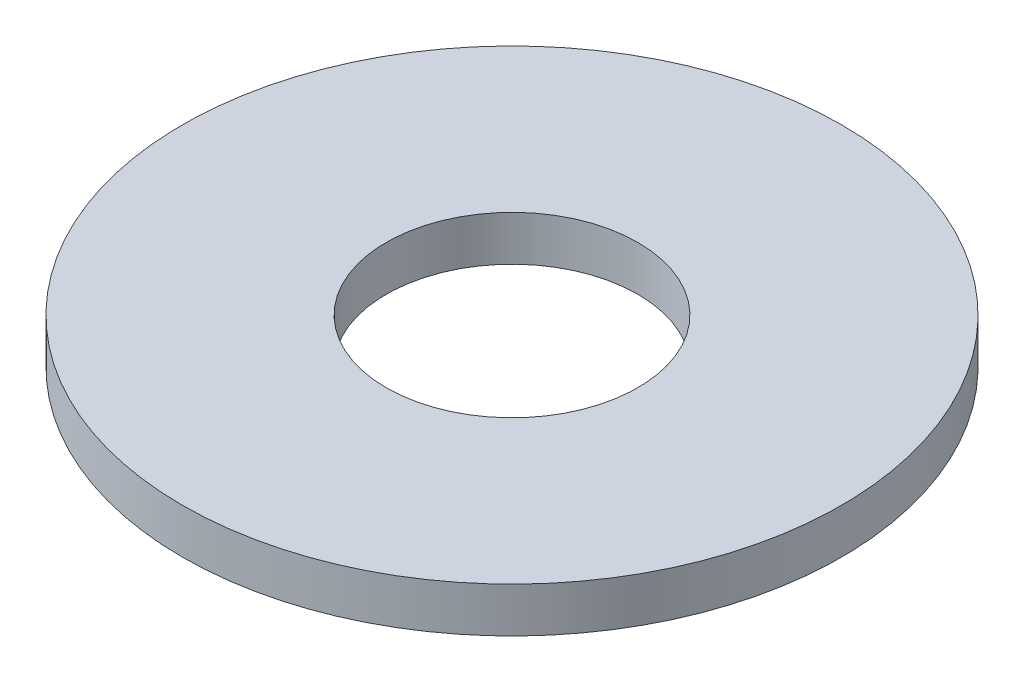
ISO-10303-21;
HEADER;
FILE_DESCRIPTION(('STEP AP214'),'2;1');
FILE_NAME('part.step','',(''),(''),'','','');
FILE_SCHEMA(('AUTOMOTIVE_DESIGN { 1 0 10303 214 1 1 1 1 }'));
ENDSEC;
DATA;
#1=APPLICATION_CONTEXT('core data for automotive mechanical design processes');
#2=APPLICATION_PROTOCOL_DEFINITION('international standard','automotive_design',2000,#1);
#3=PRODUCT_CONTEXT('',#1,'mechanical');
#4=PRODUCT('Part','Part','',(#3));
#5=PRODUCT_RELATED_PRODUCT_CATEGORY('part','',(#4));
#6=PRODUCT_DEFINITION_FORMATION('','',#4);
#7=PRODUCT_DEFINITION_CONTEXT('part definition',#1,'design');
#8=PRODUCT_DEFINITION('design','',#6,#7);
#9=PRODUCT_DEFINITION_SHAPE('','',#8);
#10=(LENGTH_UNIT() NAMED_UNIT(*) SI_UNIT(.MILLI.,.METRE.));
#11=(NAMED_UNIT(*) PLANE_ANGLE_UNIT() SI_UNIT($,.RADIAN.));
#12=(NAMED_UNIT(*) SI_UNIT($,.STERADIAN.) SOLID_ANGLE_UNIT());
#13=UNCERTAINTY_MEASURE_WITH_UNIT(LENGTH_MEASURE(1.E-05),#10,'distance_accuracy_value','');
#14=(GEOMETRIC_REPRESENTATION_CONTEXT(3) GLOBAL_UNCERTAINTY_ASSIGNED_CONTEXT((#13)) GLOBAL_UNIT_ASSIGNED_CONTEXT((#10,
#11,#12)) REPRESENTATION_CONTEXT('',''));
#15=CARTESIAN_POINT('',(0.,0.,0.));
#16=DIRECTION('',(0.,0.,1.));
#17=DIRECTION('',(1.,0.,0.));
#18=AXIS2_PLACEMENT_3D('',#15,#16,#17);
#19=CARTESIAN_POINT('',(0.,0.,0.));
#20=DIRECTION('',(0.,-1.,0.));
#21=DIRECTION('',(0.,0.,-1.));
#22=AXIS2_PLACEMENT_3D('',#19,#20,#21);
#23=CYLINDRICAL_SURFACE('',#22,11.);
#24=CARTESIAN_POINT('',(0.,1.5,0.));
#25=DIRECTION('',(0.,-1.,0.));
#26=DIRECTION('',(0.,0.,-1.));
#27=AXIS2_PLACEMENT_3D('',#24,#25,#26);
#28=CIRCLE('',#27,11.);
#29=CARTESIAN_POINT('',(0.,1.5,-11.));
#30=VERTEX_POINT('',#29);
#31=EDGE_CURVE('E46',#30,#30,#28,.T.);
#32=ORIENTED_EDGE('',*,*,#31,.T.);
#33=EDGE_LOOP('',(#32));
#34=FACE_BOUND('',#33,.T.);
#35=CARTESIAN_POINT('',(0.,0.,0.));
#36=DIRECTION('',(0.,-1.,0.));
#37=DIRECTION('',(0.,0.,-1.));
#38=AXIS2_PLACEMENT_3D('',#35,#36,#37);
#39=CIRCLE('',#38,11.);
#40=CARTESIAN_POINT('',(0.,0.,-11.));
#41=VERTEX_POINT('',#40);
#42=EDGE_CURVE('E10',#41,#41,#39,.T.);
#43=ORIENTED_EDGE('',*,*,#42,.F.);
#44=EDGE_LOOP('',(#43));
#45=FACE_BOUND('',#44,.T.);
#46=ADVANCED_FACE('F32',(#34,#45),#23,.T.);
#47=CARTESIAN_POINT('',(4.2,0.,0.));
#48=DIRECTION('',(0.,-1.,0.));
#49=DIRECTION('',(0.,0.,-1.));
#50=AXIS2_PLACEMENT_3D('',#47,#48,#49);
#51=PLANE('',#50);
#52=ORIENTED_EDGE('',*,*,#42,.T.);
#53=EDGE_LOOP('',(#52));
#54=FACE_BOUND('',#53,.T.);
#55=CARTESIAN_POINT('',(0.,0.,0.));
#56=DIRECTION('',(0.,-1.,0.));
#57=DIRECTION('',(0.,0.,-1.));
#58=AXIS2_PLACEMENT_3D('',#55,#56,#57);
#59=CIRCLE('',#58,4.2);
#60=CARTESIAN_POINT('',(0.,0.,-4.2));
#61=VERTEX_POINT('',#60);
#62=EDGE_CURVE('E38',#61,#61,#59,.T.);
#63=ORIENTED_EDGE('',*,*,#62,.F.);
#64=EDGE_LOOP('',(#63));
#65=FACE_BOUND('',#64,.T.);
#66=ADVANCED_FACE('F62',(#54,#65),#51,.T.);
#67=CARTESIAN_POINT('',(0.,0.,0.));
#68=DIRECTION('',(0.,-1.,0.));
#69=DIRECTION('',(0.,0.,-1.));
#70=AXIS2_PLACEMENT_3D('',#67,#68,#69);
#71=CYLINDRICAL_SURFACE('',#70,4.2);
#72=ORIENTED_EDGE('',*,*,#62,.T.);
#73=EDGE_LOOP('',(#72));
#74=FACE_BOUND('',#73,.T.);
#75=CARTESIAN_POINT('',(0.,1.5,0.));
#76=DIRECTION('',(0.,-1.,0.));
#77=DIRECTION('',(0.,0.,-1.));
#78=AXIS2_PLACEMENT_3D('',#75,#76,#77);
#79=CIRCLE('',#78,4.2);
#80=CARTESIAN_POINT('',(0.,1.5,-4.2));
#81=VERTEX_POINT('',#80);
#82=EDGE_CURVE('E42',#81,#81,#79,.T.);
#83=ORIENTED_EDGE('',*,*,#82,.F.);
#84=EDGE_LOOP('',(#83));
#85=FACE_BOUND('',#84,.T.);
#86=ADVANCED_FACE('F56',(#74,#85),#71,.F.);
#87=CARTESIAN_POINT('',(11.,1.5,0.));
#88=DIRECTION('',(0.,1.,0.));
#89=DIRECTION('',(0.,0.,1.));
#90=AXIS2_PLACEMENT_3D('',#87,#88,#89);
#91=PLANE('',#90);
#92=ORIENTED_EDGE('',*,*,#82,.T.);
#93=EDGE_LOOP('',(#92));
#94=FACE_BOUND('',#93,.T.);
#95=ORIENTED_EDGE('',*,*,#31,.F.);
#96=EDGE_LOOP('',(#95));
#97=FACE_BOUND('',#96,.T.);
#98=ADVANCED_FACE('F54',(#94,#97),#91,.T.);
#99=CLOSED_SHELL('',(#46,#66,#86,#98));
#100=MANIFOLD_SOLID_BREP('B2',#99);
#101=ADVANCED_BREP_SHAPE_REPRESENTATION('',(#18,#100),#14);
#102=SHAPE_DEFINITION_REPRESENTATION(#9,#101);
ENDSEC;
END-ISO-10303-21;
